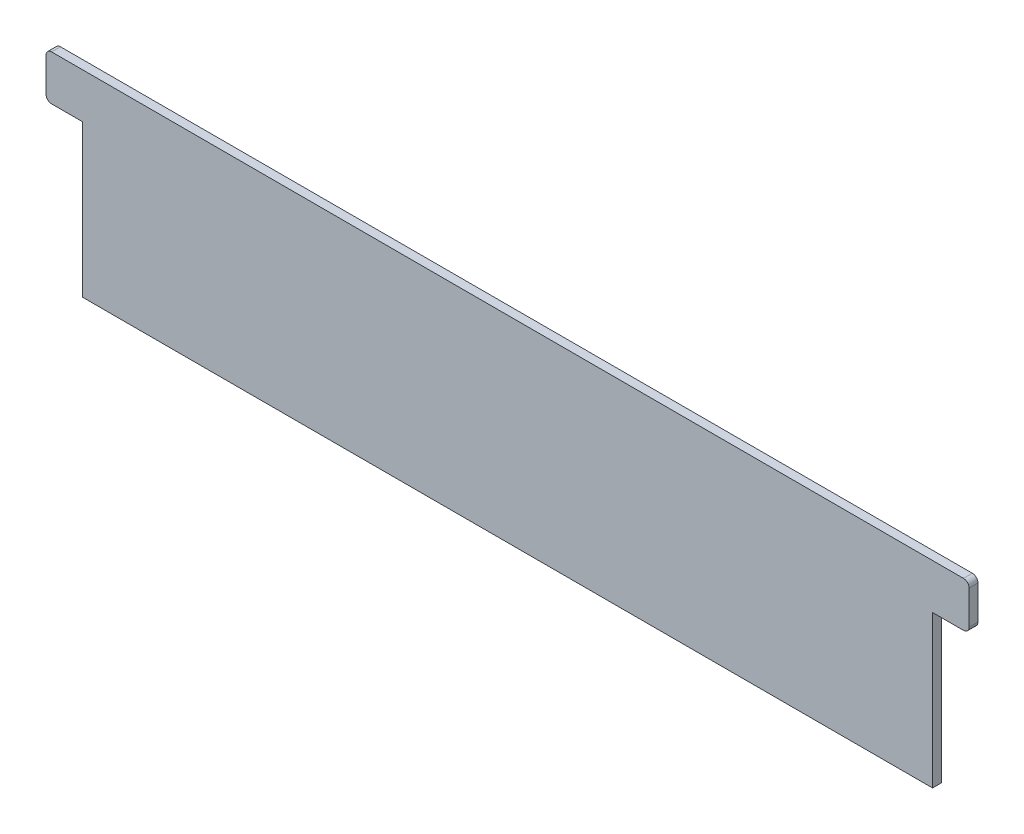
ISO-10303-21;
HEADER;
FILE_DESCRIPTION(('STEP AP214'),'2;1');
FILE_NAME('part.step','',(''),(''),'','','');
FILE_SCHEMA(('AUTOMOTIVE_DESIGN { 1 0 10303 214 1 1 1 1 }'));
ENDSEC;
DATA;
#1=APPLICATION_CONTEXT('core data for automotive mechanical design processes');
#2=APPLICATION_PROTOCOL_DEFINITION('international standard','automotive_design',2000,#1);
#3=PRODUCT_CONTEXT('',#1,'mechanical');
#4=PRODUCT('Part','Part','',(#3));
#5=PRODUCT_RELATED_PRODUCT_CATEGORY('part','',(#4));
#6=PRODUCT_DEFINITION_FORMATION('','',#4);
#7=PRODUCT_DEFINITION_CONTEXT('part definition',#1,'design');
#8=PRODUCT_DEFINITION('design','',#6,#7);
#9=PRODUCT_DEFINITION_SHAPE('','',#8);
#10=(LENGTH_UNIT() NAMED_UNIT(*) SI_UNIT(.MILLI.,.METRE.));
#11=(NAMED_UNIT(*) PLANE_ANGLE_UNIT() SI_UNIT($,.RADIAN.));
#12=(NAMED_UNIT(*) SI_UNIT($,.STERADIAN.) SOLID_ANGLE_UNIT());
#13=UNCERTAINTY_MEASURE_WITH_UNIT(LENGTH_MEASURE(1.E-05),#10,'distance_accuracy_value','');
#14=(GEOMETRIC_REPRESENTATION_CONTEXT(3) GLOBAL_UNCERTAINTY_ASSIGNED_CONTEXT((#13)) GLOBAL_UNIT_ASSIGNED_CONTEXT((#10,
#11,#12)) REPRESENTATION_CONTEXT('',''));
#15=CARTESIAN_POINT('',(0.,0.,0.));
#16=DIRECTION('',(0.,0.,1.));
#17=DIRECTION('',(1.,0.,0.));
#18=AXIS2_PLACEMENT_3D('',#15,#16,#17);
#19=CARTESIAN_POINT('',(-260.35,42.8625000000003,2.5));
#20=DIRECTION('',(1.,0.,0.));
#21=DIRECTION('',(0.,0.,-1.));
#22=AXIS2_PLACEMENT_3D('',#19,#20,#21);
#23=PLANE('',#22);
#24=DIRECTION('',(0.,-1.,0.));
#25=VECTOR('',#24,1.);
#26=CARTESIAN_POINT('',(-260.35,42.8625000000003,-2.5));
#27=LINE('',#26,#25);
#28=CARTESIAN_POINT('',(-260.35,65.0875000000003,-2.5));
#29=VERTEX_POINT('',#28);
#30=CARTESIAN_POINT('',(-260.35,46.0375000000002,-2.5));
#31=VERTEX_POINT('',#30);
#32=EDGE_CURVE('E163',#29,#31,#27,.T.);
#33=ORIENTED_EDGE('',*,*,#32,.T.);
#34=DIRECTION('',(0.,0.,-1.));
#35=VECTOR('',#34,1.);
#36=CARTESIAN_POINT('',(-260.35,46.0375000000002,2.5));
#37=LINE('',#36,#35);
#38=CARTESIAN_POINT('',(-260.35,46.0375000000002,2.5));
#39=VERTEX_POINT('',#38);
#40=EDGE_CURVE('E199',#31,#39,#37,.F.);
#41=ORIENTED_EDGE('',*,*,#40,.T.);
#42=DIRECTION('',(0.,-1.,0.));
#43=VECTOR('',#42,1.);
#44=CARTESIAN_POINT('',(-260.35,42.8625000000003,2.5));
#45=LINE('',#44,#43);
#46=CARTESIAN_POINT('',(-260.35,65.0875000000003,2.5));
#47=VERTEX_POINT('',#46);
#48=EDGE_CURVE('E133',#47,#39,#45,.T.);
#49=ORIENTED_EDGE('',*,*,#48,.F.);
#50=DIRECTION('',(0.,0.,-1.));
#51=VECTOR('',#50,1.);
#52=CARTESIAN_POINT('',(-260.35,65.0875000000003,2.5));
#53=LINE('',#52,#51);
#54=EDGE_CURVE('E196',#47,#29,#53,.T.);
#55=ORIENTED_EDGE('',*,*,#54,.T.);
#56=EDGE_LOOP('',(#33,#41,#49,#55));
#57=FACE_BOUND('',#56,.T.);
#58=ADVANCED_FACE('F33',(#57),#23,.F.);
#59=CARTESIAN_POINT('',(-239.7125,42.8625,2.5));
#60=DIRECTION('',(0.,1.,0.));
#61=DIRECTION('',(-1.,0.,0.));
#62=AXIS2_PLACEMENT_3D('',#59,#60,#61);
#63=PLANE('',#62);
#64=DIRECTION('',(1.,0.,0.));
#65=VECTOR('',#64,1.);
#66=CARTESIAN_POINT('',(-239.7125,42.8625,2.5));
#67=LINE('',#66,#65);
#68=CARTESIAN_POINT('',(-257.175,42.8625000000002,2.5));
#69=VERTEX_POINT('',#68);
#70=CARTESIAN_POINT('',(-239.7125,42.8625,2.5));
#71=VERTEX_POINT('',#70);
#72=EDGE_CURVE('E121',#69,#71,#67,.T.);
#73=ORIENTED_EDGE('',*,*,#72,.F.);
#74=DIRECTION('',(0.,0.,-1.));
#75=VECTOR('',#74,1.);
#76=CARTESIAN_POINT('',(-257.175,42.8625000000002,2.5));
#77=LINE('',#76,#75);
#78=CARTESIAN_POINT('',(-257.175,42.8625000000002,-2.5));
#79=VERTEX_POINT('',#78);
#80=EDGE_CURVE('E142',#69,#79,#77,.T.);
#81=ORIENTED_EDGE('',*,*,#80,.T.);
#82=DIRECTION('',(1.,0.,0.));
#83=VECTOR('',#82,1.);
#84=CARTESIAN_POINT('',(-239.7125,42.8625,-2.5));
#85=LINE('',#84,#83);
#86=CARTESIAN_POINT('',(-239.7125,42.8625,-2.5));
#87=VERTEX_POINT('',#86);
#88=EDGE_CURVE('E139',#79,#87,#85,.T.);
#89=ORIENTED_EDGE('',*,*,#88,.T.);
#90=DIRECTION('',(0.,0.,-1.));
#91=VECTOR('',#90,1.);
#92=CARTESIAN_POINT('',(-239.7125,42.8625,2.5));
#93=LINE('',#92,#91);
#94=EDGE_CURVE('E136',#71,#87,#93,.T.);
#95=ORIENTED_EDGE('',*,*,#94,.F.);
#96=EDGE_LOOP('',(#73,#81,#89,#95));
#97=FACE_BOUND('',#96,.T.);
#98=ADVANCED_FACE('F137',(#97),#63,.F.);
#99=CARTESIAN_POINT('',(-239.7125,-42.8625,2.5));
#100=DIRECTION('',(1.,0.,0.));
#101=DIRECTION('',(0.,0.,-1.));
#102=AXIS2_PLACEMENT_3D('',#99,#100,#101);
#103=PLANE('',#102);
#104=DIRECTION('',(0.,-1.,0.));
#105=VECTOR('',#104,1.);
#106=CARTESIAN_POINT('',(-239.7125,-42.8625,-2.5));
#107=LINE('',#106,#105);
#108=CARTESIAN_POINT('',(-239.7125,-42.8625,-2.5));
#109=VERTEX_POINT('',#108);
#110=EDGE_CURVE('E167',#87,#109,#107,.T.);
#111=ORIENTED_EDGE('',*,*,#110,.T.);
#112=DIRECTION('',(0.,0.,-1.));
#113=VECTOR('',#112,1.);
#114=CARTESIAN_POINT('',(-239.7125,-42.8625,2.5));
#115=LINE('',#114,#113);
#116=CARTESIAN_POINT('',(-239.7125,-42.8625,2.5));
#117=VERTEX_POINT('',#116);
#118=EDGE_CURVE('E143',#117,#109,#115,.T.);
#119=ORIENTED_EDGE('',*,*,#118,.F.);
#120=DIRECTION('',(0.,-1.,0.));
#121=VECTOR('',#120,1.);
#122=CARTESIAN_POINT('',(-239.7125,-42.8625,2.5));
#123=LINE('',#122,#121);
#124=EDGE_CURVE('E126',#71,#117,#123,.T.);
#125=ORIENTED_EDGE('',*,*,#124,.F.);
#126=ORIENTED_EDGE('',*,*,#94,.T.);
#127=EDGE_LOOP('',(#111,#119,#125,#126));
#128=FACE_BOUND('',#127,.T.);
#129=ADVANCED_FACE('F145',(#128),#103,.F.);
#130=CARTESIAN_POINT('',(239.7125,-42.8625,2.5));
#131=DIRECTION('',(0.,1.,0.));
#132=DIRECTION('',(0.,0.,1.));
#133=AXIS2_PLACEMENT_3D('',#130,#131,#132);
#134=PLANE('',#133);
#135=DIRECTION('',(1.,0.,0.));
#136=VECTOR('',#135,1.);
#137=CARTESIAN_POINT('',(239.7125,-42.8625,-2.5));
#138=LINE('',#137,#136);
#139=CARTESIAN_POINT('',(239.7125,-42.8625,-2.5));
#140=VERTEX_POINT('',#139);
#141=EDGE_CURVE('E169',#109,#140,#138,.T.);
#142=ORIENTED_EDGE('',*,*,#141,.T.);
#143=DIRECTION('',(0.,0.,-1.));
#144=VECTOR('',#143,1.);
#145=CARTESIAN_POINT('',(239.7125,-42.8625,2.5));
#146=LINE('',#145,#144);
#147=CARTESIAN_POINT('',(239.7125,-42.8625,2.5));
#148=VERTEX_POINT('',#147);
#149=EDGE_CURVE('E183',#148,#140,#146,.T.);
#150=ORIENTED_EDGE('',*,*,#149,.F.);
#151=DIRECTION('',(1.,0.,0.));
#152=VECTOR('',#151,1.);
#153=CARTESIAN_POINT('',(239.7125,-42.8625,2.5));
#154=LINE('',#153,#152);
#155=EDGE_CURVE('E148',#117,#148,#154,.T.);
#156=ORIENTED_EDGE('',*,*,#155,.F.);
#157=ORIENTED_EDGE('',*,*,#118,.T.);
#158=EDGE_LOOP('',(#142,#150,#156,#157));
#159=FACE_BOUND('',#158,.T.);
#160=ADVANCED_FACE('F240',(#159),#134,.F.);
#161=CARTESIAN_POINT('',(239.7125,42.8625,2.5));
#162=DIRECTION('',(-1.,0.,0.));
#163=DIRECTION('',(0.,0.,1.));
#164=AXIS2_PLACEMENT_3D('',#161,#162,#163);
#165=PLANE('',#164);
#166=DIRECTION('',(0.,1.,0.));
#167=VECTOR('',#166,1.);
#168=CARTESIAN_POINT('',(239.7125,42.8625,-2.5));
#169=LINE('',#168,#167);
#170=CARTESIAN_POINT('',(239.7125,42.8625,-2.5));
#171=VERTEX_POINT('',#170);
#172=EDGE_CURVE('E171',#140,#171,#169,.T.);
#173=ORIENTED_EDGE('',*,*,#172,.T.);
#174=DIRECTION('',(0.,0.,-1.));
#175=VECTOR('',#174,1.);
#176=CARTESIAN_POINT('',(239.7125,42.8625,2.5));
#177=LINE('',#176,#175);
#178=CARTESIAN_POINT('',(239.7125,42.8625,2.5));
#179=VERTEX_POINT('',#178);
#180=EDGE_CURVE('E162',#179,#171,#177,.T.);
#181=ORIENTED_EDGE('',*,*,#180,.F.);
#182=DIRECTION('',(0.,1.,0.));
#183=VECTOR('',#182,1.);
#184=CARTESIAN_POINT('',(239.7125,42.8625,2.5));
#185=LINE('',#184,#183);
#186=EDGE_CURVE('E150',#148,#179,#185,.T.);
#187=ORIENTED_EDGE('',*,*,#186,.F.);
#188=ORIENTED_EDGE('',*,*,#149,.T.);
#189=EDGE_LOOP('',(#173,#181,#187,#188));
#190=FACE_BOUND('',#189,.T.);
#191=ADVANCED_FACE('F246',(#190),#165,.F.);
#192=CARTESIAN_POINT('',(260.35,42.8625000000003,2.5));
#193=DIRECTION('',(0.,1.,0.));
#194=DIRECTION('',(-1.,0.,0.));
#195=AXIS2_PLACEMENT_3D('',#192,#193,#194);
#196=PLANE('',#195);
#197=DIRECTION('',(1.,0.,0.));
#198=VECTOR('',#197,1.);
#199=CARTESIAN_POINT('',(260.35,42.8625000000003,-2.5));
#200=LINE('',#199,#198);
#201=CARTESIAN_POINT('',(257.175,42.8625000000002,-2.5));
#202=VERTEX_POINT('',#201);
#203=EDGE_CURVE('E173',#171,#202,#200,.T.);
#204=ORIENTED_EDGE('',*,*,#203,.T.);
#205=DIRECTION('',(0.,0.,-1.));
#206=VECTOR('',#205,1.);
#207=CARTESIAN_POINT('',(257.175,42.8625000000002,2.5));
#208=LINE('',#207,#206);
#209=CARTESIAN_POINT('',(257.175,42.8625000000002,2.5));
#210=VERTEX_POINT('',#209);
#211=EDGE_CURVE('E11',#202,#210,#208,.F.);
#212=ORIENTED_EDGE('',*,*,#211,.T.);
#213=DIRECTION('',(1.,0.,0.));
#214=VECTOR('',#213,1.);
#215=CARTESIAN_POINT('',(260.35,42.8625000000003,2.5));
#216=LINE('',#215,#214);
#217=EDGE_CURVE('E155',#179,#210,#216,.T.);
#218=ORIENTED_EDGE('',*,*,#217,.F.);
#219=ORIENTED_EDGE('',*,*,#180,.T.);
#220=EDGE_LOOP('',(#204,#212,#218,#219));
#221=FACE_BOUND('',#220,.T.);
#222=ADVANCED_FACE('F249',(#221),#196,.F.);
#223=CARTESIAN_POINT('',(260.35,68.2625000000003,2.5));
#224=DIRECTION('',(-1.,0.,0.));
#225=DIRECTION('',(0.,0.,1.));
#226=AXIS2_PLACEMENT_3D('',#223,#224,#225);
#227=PLANE('',#226);
#228=DIRECTION('',(0.,1.,0.));
#229=VECTOR('',#228,1.);
#230=CARTESIAN_POINT('',(260.35,68.2625000000003,-2.5));
#231=LINE('',#230,#229);
#232=CARTESIAN_POINT('',(260.35,46.0375000000002,-2.5));
#233=VERTEX_POINT('',#232);
#234=CARTESIAN_POINT('',(260.35,65.0875000000003,-2.5));
#235=VERTEX_POINT('',#234);
#236=EDGE_CURVE('E176',#233,#235,#231,.T.);
#237=ORIENTED_EDGE('',*,*,#236,.T.);
#238=DIRECTION('',(0.,0.,-1.));
#239=VECTOR('',#238,1.);
#240=CARTESIAN_POINT('',(260.35,65.0875000000003,2.5));
#241=LINE('',#240,#239);
#242=CARTESIAN_POINT('',(260.35,65.0875000000003,2.5));
#243=VERTEX_POINT('',#242);
#244=EDGE_CURVE('E41',#235,#243,#241,.F.);
#245=ORIENTED_EDGE('',*,*,#244,.T.);
#246=DIRECTION('',(0.,1.,0.));
#247=VECTOR('',#246,1.);
#248=CARTESIAN_POINT('',(260.35,68.2625000000003,2.5));
#249=LINE('',#248,#247);
#250=CARTESIAN_POINT('',(260.35,46.0375000000002,2.5));
#251=VERTEX_POINT('',#250);
#252=EDGE_CURVE('E158',#251,#243,#249,.T.);
#253=ORIENTED_EDGE('',*,*,#252,.F.);
#254=DIRECTION('',(0.,0.,-1.));
#255=VECTOR('',#254,1.);
#256=CARTESIAN_POINT('',(260.35,46.0375000000002,2.5));
#257=LINE('',#256,#255);
#258=EDGE_CURVE('E211',#251,#233,#257,.T.);
#259=ORIENTED_EDGE('',*,*,#258,.T.);
#260=EDGE_LOOP('',(#237,#245,#253,#259));
#261=FACE_BOUND('',#260,.T.);
#262=ADVANCED_FACE('F216',(#261),#227,.F.);
#263=CARTESIAN_POINT('',(-260.35,68.2625000000003,2.5));
#264=DIRECTION('',(0.,-1.,0.));
#265=DIRECTION('',(0.,0.,-1.));
#266=AXIS2_PLACEMENT_3D('',#263,#264,#265);
#267=PLANE('',#266);
#268=DIRECTION('',(-1.,0.,0.));
#269=VECTOR('',#268,1.);
#270=CARTESIAN_POINT('',(-260.35,68.2625000000003,-2.5));
#271=LINE('',#270,#269);
#272=CARTESIAN_POINT('',(257.175,68.2625000000003,-2.5));
#273=VERTEX_POINT('',#272);
#274=CARTESIAN_POINT('',(-257.175,68.2625000000003,-2.5));
#275=VERTEX_POINT('',#274);
#276=EDGE_CURVE('E179',#273,#275,#271,.T.);
#277=ORIENTED_EDGE('',*,*,#276,.T.);
#278=DIRECTION('',(0.,0.,-1.));
#279=VECTOR('',#278,1.);
#280=CARTESIAN_POINT('',(-257.175,68.2625000000003,2.5));
#281=LINE('',#280,#279);
#282=CARTESIAN_POINT('',(-257.175,68.2625000000003,2.5));
#283=VERTEX_POINT('',#282);
#284=EDGE_CURVE('E48',#275,#283,#281,.F.);
#285=ORIENTED_EDGE('',*,*,#284,.T.);
#286=DIRECTION('',(-1.,0.,0.));
#287=VECTOR('',#286,1.);
#288=CARTESIAN_POINT('',(-260.35,68.2625000000003,2.5));
#289=LINE('',#288,#287);
#290=CARTESIAN_POINT('',(257.175,68.2625000000003,2.5));
#291=VERTEX_POINT('',#290);
#292=EDGE_CURVE('E160',#291,#283,#289,.T.);
#293=ORIENTED_EDGE('',*,*,#292,.F.);
#294=DIRECTION('',(0.,0.,-1.));
#295=VECTOR('',#294,1.);
#296=CARTESIAN_POINT('',(257.175,68.2625000000003,2.5));
#297=LINE('',#296,#295);
#298=EDGE_CURVE('E207',#291,#273,#297,.T.);
#299=ORIENTED_EDGE('',*,*,#298,.T.);
#300=EDGE_LOOP('',(#277,#285,#293,#299));
#301=FACE_BOUND('',#300,.T.);
#302=ADVANCED_FACE('F224',(#301),#267,.F.);
#303=CARTESIAN_POINT('',(0.,0.,2.5));
#304=DIRECTION('',(0.,0.,-1.));
#305=DIRECTION('',(-1.,0.,0.));
#306=AXIS2_PLACEMENT_3D('',#303,#304,#305);
#307=PLANE('',#306);
#308=ORIENTED_EDGE('',*,*,#48,.T.);
#309=CARTESIAN_POINT('',(-257.175,46.0375000000002,2.5));
#310=DIRECTION('',(0.,0.,-1.));
#311=DIRECTION('',(-1.,0.,0.));
#312=AXIS2_PLACEMENT_3D('',#309,#310,#311);
#313=CIRCLE('',#312,3.175);
#314=EDGE_CURVE('E129',#39,#69,#313,.F.);
#315=ORIENTED_EDGE('',*,*,#314,.T.);
#316=ORIENTED_EDGE('',*,*,#72,.T.);
#317=ORIENTED_EDGE('',*,*,#124,.T.);
#318=ORIENTED_EDGE('',*,*,#155,.T.);
#319=ORIENTED_EDGE('',*,*,#186,.T.);
#320=ORIENTED_EDGE('',*,*,#217,.T.);
#321=CARTESIAN_POINT('',(257.175,46.0375000000002,2.5));
#322=DIRECTION('',(0.,0.,-1.));
#323=DIRECTION('',(-1.,0.,0.));
#324=AXIS2_PLACEMENT_3D('',#321,#322,#323);
#325=CIRCLE('',#324,3.175);
#326=EDGE_CURVE('E201',#210,#251,#325,.F.);
#327=ORIENTED_EDGE('',*,*,#326,.T.);
#328=ORIENTED_EDGE('',*,*,#252,.T.);
#329=CARTESIAN_POINT('',(257.175,65.0875000000003,2.5));
#330=DIRECTION('',(0.,0.,-1.));
#331=DIRECTION('',(-1.,0.,0.));
#332=AXIS2_PLACEMENT_3D('',#329,#330,#331);
#333=CIRCLE('',#332,3.175);
#334=EDGE_CURVE('E55',#243,#291,#333,.F.);
#335=ORIENTED_EDGE('',*,*,#334,.T.);
#336=ORIENTED_EDGE('',*,*,#292,.T.);
#337=CARTESIAN_POINT('',(-257.175,65.0875000000003,2.5));
#338=DIRECTION('',(0.,0.,-1.));
#339=DIRECTION('',(-1.,0.,0.));
#340=AXIS2_PLACEMENT_3D('',#337,#338,#339);
#341=CIRCLE('',#340,3.175);
#342=EDGE_CURVE('E204',#283,#47,#341,.F.);
#343=ORIENTED_EDGE('',*,*,#342,.T.);
#344=EDGE_LOOP('',(#308,#315,#316,#317,#318,#319,#320,#327,#328,#335,#336,#343));
#345=FACE_BOUND('',#344,.T.);
#346=ADVANCED_FACE('F124',(#345),#307,.F.);
#347=CARTESIAN_POINT('',(0.,0.,-2.5));
#348=DIRECTION('',(0.,0.,-1.));
#349=DIRECTION('',(-1.,0.,0.));
#350=AXIS2_PLACEMENT_3D('',#347,#348,#349);
#351=PLANE('',#350);
#352=ORIENTED_EDGE('',*,*,#88,.F.);
#353=CARTESIAN_POINT('',(-257.175,46.0375000000002,-2.5));
#354=DIRECTION('',(0.,0.,-1.));
#355=DIRECTION('',(-1.,0.,0.));
#356=AXIS2_PLACEMENT_3D('',#353,#354,#355);
#357=CIRCLE('',#356,3.175);
#358=EDGE_CURVE('E194',#79,#31,#357,.T.);
#359=ORIENTED_EDGE('',*,*,#358,.T.);
#360=ORIENTED_EDGE('',*,*,#32,.F.);
#361=CARTESIAN_POINT('',(-257.175,65.0875000000003,-2.5));
#362=DIRECTION('',(0.,0.,-1.));
#363=DIRECTION('',(-1.,0.,0.));
#364=AXIS2_PLACEMENT_3D('',#361,#362,#363);
#365=CIRCLE('',#364,3.175);
#366=EDGE_CURVE('E192',#29,#275,#365,.T.);
#367=ORIENTED_EDGE('',*,*,#366,.T.);
#368=ORIENTED_EDGE('',*,*,#276,.F.);
#369=CARTESIAN_POINT('',(257.175,65.0875000000003,-2.5));
#370=DIRECTION('',(0.,0.,-1.));
#371=DIRECTION('',(-1.,0.,0.));
#372=AXIS2_PLACEMENT_3D('',#369,#370,#371);
#373=CIRCLE('',#372,3.175);
#374=EDGE_CURVE('E190',#273,#235,#373,.T.);
#375=ORIENTED_EDGE('',*,*,#374,.T.);
#376=ORIENTED_EDGE('',*,*,#236,.F.);
#377=CARTESIAN_POINT('',(257.175,46.0375000000002,-2.5));
#378=DIRECTION('',(0.,0.,-1.));
#379=DIRECTION('',(-1.,0.,0.));
#380=AXIS2_PLACEMENT_3D('',#377,#378,#379);
#381=CIRCLE('',#380,3.175);
#382=EDGE_CURVE('E188',#233,#202,#381,.T.);
#383=ORIENTED_EDGE('',*,*,#382,.T.);
#384=ORIENTED_EDGE('',*,*,#203,.F.);
#385=ORIENTED_EDGE('',*,*,#172,.F.);
#386=ORIENTED_EDGE('',*,*,#141,.F.);
#387=ORIENTED_EDGE('',*,*,#110,.F.);
#388=EDGE_LOOP('',(#352,#359,#360,#367,#368,#375,#376,#383,#384,#385,#386,#387));
#389=FACE_BOUND('',#388,.T.);
#390=ADVANCED_FACE('F226',(#389),#351,.T.);
#391=CARTESIAN_POINT('',(-257.175,46.0375000000002,2.5));
#392=DIRECTION('',(0.,0.,-1.));
#393=DIRECTION('',(-1.,0.,0.));
#394=AXIS2_PLACEMENT_3D('',#391,#392,#393);
#395=CYLINDRICAL_SURFACE('',#394,3.175);
#396=ORIENTED_EDGE('',*,*,#314,.F.);
#397=ORIENTED_EDGE('',*,*,#40,.F.);
#398=ORIENTED_EDGE('',*,*,#358,.F.);
#399=ORIENTED_EDGE('',*,*,#80,.F.);
#400=EDGE_LOOP('',(#396,#397,#398,#399));
#401=FACE_BOUND('',#400,.T.);
#402=ADVANCED_FACE('F236',(#401),#395,.T.);
#403=CARTESIAN_POINT('',(-257.175,65.0875000000003,2.5));
#404=DIRECTION('',(0.,0.,-1.));
#405=DIRECTION('',(-1.,0.,0.));
#406=AXIS2_PLACEMENT_3D('',#403,#404,#405);
#407=CYLINDRICAL_SURFACE('',#406,3.175);
#408=ORIENTED_EDGE('',*,*,#342,.F.);
#409=ORIENTED_EDGE('',*,*,#284,.F.);
#410=ORIENTED_EDGE('',*,*,#366,.F.);
#411=ORIENTED_EDGE('',*,*,#54,.F.);
#412=EDGE_LOOP('',(#408,#409,#410,#411));
#413=FACE_BOUND('',#412,.T.);
#414=ADVANCED_FACE('F231',(#413),#407,.T.);
#415=CARTESIAN_POINT('',(257.175,65.0875000000003,2.5));
#416=DIRECTION('',(0.,0.,-1.));
#417=DIRECTION('',(-1.,0.,0.));
#418=AXIS2_PLACEMENT_3D('',#415,#416,#417);
#419=CYLINDRICAL_SURFACE('',#418,3.175);
#420=ORIENTED_EDGE('',*,*,#334,.F.);
#421=ORIENTED_EDGE('',*,*,#244,.F.);
#422=ORIENTED_EDGE('',*,*,#374,.F.);
#423=ORIENTED_EDGE('',*,*,#298,.F.);
#424=EDGE_LOOP('',(#420,#421,#422,#423));
#425=FACE_BOUND('',#424,.T.);
#426=ADVANCED_FACE('F222',(#425),#419,.T.);
#427=CARTESIAN_POINT('',(257.175,46.0375000000002,2.5));
#428=DIRECTION('',(0.,0.,-1.));
#429=DIRECTION('',(-1.,0.,0.));
#430=AXIS2_PLACEMENT_3D('',#427,#428,#429);
#431=CYLINDRICAL_SURFACE('',#430,3.175);
#432=ORIENTED_EDGE('',*,*,#326,.F.);
#433=ORIENTED_EDGE('',*,*,#211,.F.);
#434=ORIENTED_EDGE('',*,*,#382,.F.);
#435=ORIENTED_EDGE('',*,*,#258,.F.);
#436=EDGE_LOOP('',(#432,#433,#434,#435));
#437=FACE_BOUND('',#436,.T.);
#438=ADVANCED_FACE('F35',(#437),#431,.T.);
#439=CLOSED_SHELL('',(#58,#98,#129,#160,#191,#222,#262,#302,#346,#390,#402,#414,#426,#438));
#440=MANIFOLD_SOLID_BREP('B2',#439);
#441=ADVANCED_BREP_SHAPE_REPRESENTATION('',(#18,#440),#14);
#442=SHAPE_DEFINITION_REPRESENTATION(#9,#441);
ENDSEC;
END-ISO-10303-21;
